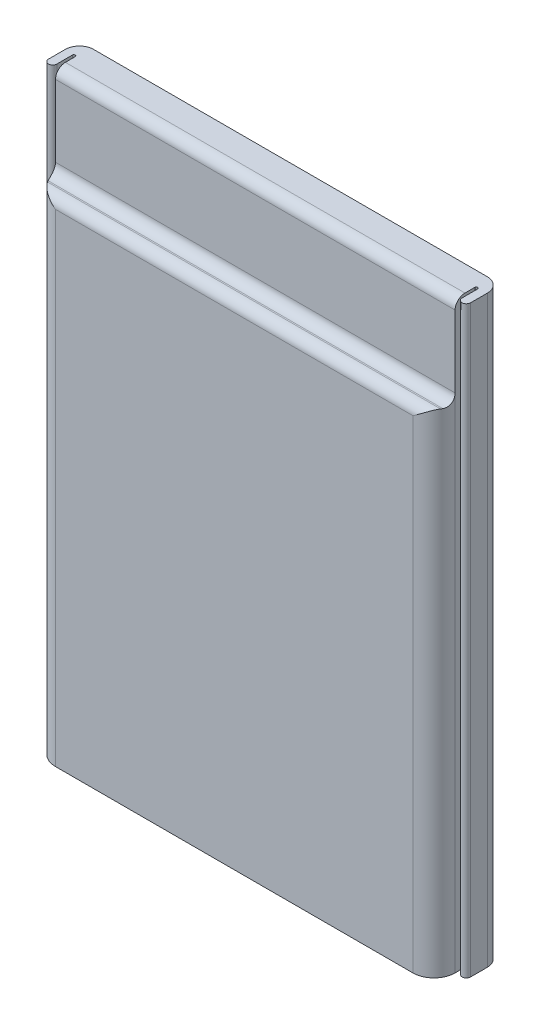
ISO-10303-21;
HEADER;
FILE_DESCRIPTION(('STEP AP214'),'2;1');
FILE_NAME('part.step','',(''),(''),'','','');
FILE_SCHEMA(('AUTOMOTIVE_DESIGN { 1 0 10303 214 1 1 1 1 }'));
ENDSEC;
DATA;
#1=APPLICATION_CONTEXT('core data for automotive mechanical design processes');
#2=APPLICATION_PROTOCOL_DEFINITION('international standard','automotive_design',2000,#1);
#3=PRODUCT_CONTEXT('',#1,'mechanical');
#4=PRODUCT('Part','Part','',(#3));
#5=PRODUCT_RELATED_PRODUCT_CATEGORY('part','',(#4));
#6=PRODUCT_DEFINITION_FORMATION('','',#4);
#7=PRODUCT_DEFINITION_CONTEXT('part definition',#1,'design');
#8=PRODUCT_DEFINITION('design','',#6,#7);
#9=PRODUCT_DEFINITION_SHAPE('','',#8);
#10=(LENGTH_UNIT() NAMED_UNIT(*) SI_UNIT(.MILLI.,.METRE.));
#11=(NAMED_UNIT(*) PLANE_ANGLE_UNIT() SI_UNIT($,.RADIAN.));
#12=(NAMED_UNIT(*) SI_UNIT($,.STERADIAN.) SOLID_ANGLE_UNIT());
#13=UNCERTAINTY_MEASURE_WITH_UNIT(LENGTH_MEASURE(1.E-05),#10,'distance_accuracy_value','');
#14=(GEOMETRIC_REPRESENTATION_CONTEXT(3) GLOBAL_UNCERTAINTY_ASSIGNED_CONTEXT((#13)) GLOBAL_UNIT_ASSIGNED_CONTEXT((#10,
#11,#12)) REPRESENTATION_CONTEXT('',''));
#15=CARTESIAN_POINT('',(0.,0.,0.));
#16=DIRECTION('',(0.,0.,1.));
#17=DIRECTION('',(1.,0.,0.));
#18=AXIS2_PLACEMENT_3D('',#15,#16,#17);
#19=CARTESIAN_POINT('',(-14.2,20.75,2.5));
#20=DIRECTION('',(1.,0.,0.));
#21=DIRECTION('',(0.,0.,-1.));
#22=AXIS2_PLACEMENT_3D('',#19,#20,#21);
#23=PLANE('',#22);
#24=CARTESIAN_POINT('',(-14.2,20.05,1.8));
#25=DIRECTION('',(1.,0.,0.));
#26=DIRECTION('',(0.,0.,-1.));
#27=AXIS2_PLACEMENT_3D('',#24,#25,#26);
#28=CIRCLE('',#27,0.700000000000001);
#29=CARTESIAN_POINT('',(-14.2,20.75,1.8));
#30=VERTEX_POINT('',#29);
#31=CARTESIAN_POINT('',(-14.2,20.05,2.5));
#32=VERTEX_POINT('',#31);
#33=EDGE_CURVE('E452',#30,#32,#28,.T.);
#34=ORIENTED_EDGE('',*,*,#33,.F.);
#35=DIRECTION('',(0.,0.,1.));
#36=VECTOR('',#35,1.);
#37=CARTESIAN_POINT('',(-14.2,20.75,2.5));
#38=LINE('',#37,#36);
#39=CARTESIAN_POINT('',(-14.2,20.75,1.1));
#40=VERTEX_POINT('',#39);
#41=EDGE_CURVE('E268',#40,#30,#38,.T.);
#42=ORIENTED_EDGE('',*,*,#41,.F.);
#43=DIRECTION('',(0.,-1.,0.));
#44=VECTOR('',#43,1.);
#45=CARTESIAN_POINT('',(-14.2,20.75,1.1));
#46=LINE('',#45,#44);
#47=CARTESIAN_POINT('',(-14.2,-20.75,1.1));
#48=VERTEX_POINT('',#47);
#49=EDGE_CURVE('E236',#40,#48,#46,.T.);
#50=ORIENTED_EDGE('',*,*,#49,.T.);
#51=DIRECTION('',(0.,0.,1.));
#52=VECTOR('',#51,1.);
#53=CARTESIAN_POINT('',(-14.2,-20.75,2.5));
#54=LINE('',#53,#52);
#55=CARTESIAN_POINT('',(-14.2,-20.75,2.5));
#56=VERTEX_POINT('',#55);
#57=EDGE_CURVE('E191',#48,#56,#54,.T.);
#58=ORIENTED_EDGE('',*,*,#57,.T.);
#59=DIRECTION('',(0.,-1.,0.));
#60=VECTOR('',#59,1.);
#61=CARTESIAN_POINT('',(-14.2,20.75,2.5));
#62=LINE('',#61,#60);
#63=CARTESIAN_POINT('',(-14.2,14.95,2.5));
#64=VERTEX_POINT('',#63);
#65=EDGE_CURVE('E234',#64,#56,#62,.T.);
#66=ORIENTED_EDGE('',*,*,#65,.F.);
#67=DIRECTION('',(0.,-1.,0.));
#68=VECTOR('',#67,1.);
#69=CARTESIAN_POINT('',(-14.2,20.75,2.5));
#70=LINE('',#69,#68);
#71=EDGE_CURVE('E435',#32,#64,#70,.T.);
#72=ORIENTED_EDGE('',*,*,#71,.F.);
#73=EDGE_LOOP('',(#34,#42,#50,#58,#66,#72));
#74=FACE_BOUND('',#73,.T.);
#75=ADVANCED_FACE('F35',(#74),#23,.F.);
#76=CARTESIAN_POINT('',(-12.7,20.75,2.5));
#77=DIRECTION('',(0.,-1.,0.));
#78=DIRECTION('',(0.,0.,-1.));
#79=AXIS2_PLACEMENT_3D('',#76,#77,#78);
#80=CYLINDRICAL_SURFACE('',#79,1.5);
#81=CARTESIAN_POINT('',(-14.2,14.95,2.5));
#82=CARTESIAN_POINT('',(-14.1999561462918,14.9107046356708,2.49996665730778));
#83=CARTESIAN_POINT('',(-14.1999992482191,14.8714183542362,2.50330687650236));
#84=CARTESIAN_POINT('',(-14.1999354164387,14.793967429043,2.51649162392108));
#85=CARTESIAN_POINT('',(-14.1998285413028,14.7558023533524,2.52633361216168));
#86=CARTESIAN_POINT('',(-14.1991410740691,14.6816427129099,2.55228720768836));
#87=CARTESIAN_POINT('',(-14.198560198109,14.645649462663,2.56840256885166));
#88=CARTESIAN_POINT('',(-14.1963416248353,14.5768985139939,2.60642040046059));
#89=CARTESIAN_POINT('',(-14.1947040963163,14.5441402997553,2.62832194626366));
#90=CARTESIAN_POINT('',(-14.1897174760021,14.4831035334169,2.677010616108));
#91=CARTESIAN_POINT('',(-14.1863838519975,14.4547874718156,2.70375220489331));
#92=CARTESIAN_POINT('',(-14.1773485077593,14.4031440562724,2.76131822449821));
#93=CARTESIAN_POINT('',(-14.1716483772418,14.379813369279,2.79213990504022));
#94=CARTESIAN_POINT('',(-14.1576029305689,14.3395024190182,2.85553925871004));
#95=CARTESIAN_POINT('',(-14.1493602479741,14.3223237472487,2.88801374582642));
#96=CARTESIAN_POINT('',(-14.1299019482591,14.2934557940061,2.95451175346917));
#97=CARTESIAN_POINT('',(-14.1186838942042,14.281771034092,2.98853652472772));
#98=CARTESIAN_POINT('',(-14.0949002980657,14.2650221516101,3.05250454046783));
#99=CARTESIAN_POINT('',(-14.0826903337623,14.2593026309378,3.08241352289095));
#100=CARTESIAN_POINT('',(-14.0561914981021,14.2517861713414,3.14172953845446));
#101=CARTESIAN_POINT('',(-14.0419070504447,14.249981012626,3.17113749452254));
#102=CARTESIAN_POINT('',(-14.0266499161422,14.25,3.2));
#103=B_SPLINE_CURVE_WITH_KNOTS('',3,(#81,#82,#83,#84,#85,#86,#87,#88,#89,#90,#91,#92,#93,#94,
#95,#96,#97,#98,#99,#100,#101,#102),.UNSPECIFIED.,.F.,.F.,(4,2,2,2,2,2,2,2,2,2,4),(0.,
0.117731700981388,0.235417436029151,0.353173700690375,0.470911159062051,0.587593641092844,
0.704197867411869,0.816603597131317,0.929101676953002,1.0272186022184,1.12512929085055),.UNSPECIFIED.);
#104=CARTESIAN_POINT('',(-14.0266499161422,14.25,3.2));
#105=VERTEX_POINT('',#104);
#106=EDGE_CURVE('E432',#64,#105,#103,.T.);
#107=ORIENTED_EDGE('',*,*,#106,.F.);
#108=ORIENTED_EDGE('',*,*,#65,.T.);
#109=CARTESIAN_POINT('',(-12.7,-20.75,2.5));
#110=DIRECTION('',(0.,1.,0.));
#111=DIRECTION('',(0.,0.,1.));
#112=AXIS2_PLACEMENT_3D('',#109,#110,#111);
#113=CIRCLE('',#112,1.5);
#114=CARTESIAN_POINT('',(-12.7,-20.75,4.));
#115=VERTEX_POINT('',#114);
#116=EDGE_CURVE('E194',#56,#115,#113,.T.);
#117=ORIENTED_EDGE('',*,*,#116,.T.);
#118=DIRECTION('',(0.,-1.,0.));
#119=VECTOR('',#118,1.);
#120=CARTESIAN_POINT('',(-12.7,20.75,4.));
#121=LINE('',#120,#119);
#122=CARTESIAN_POINT('',(-12.7,13.55,4.));
#123=VERTEX_POINT('',#122);
#124=EDGE_CURVE('E232',#123,#115,#121,.T.);
#125=ORIENTED_EDGE('',*,*,#124,.F.);
#126=CARTESIAN_POINT('',(-13.968857754045,14.25,3.3));
#127=CARTESIAN_POINT('',(-13.9527784417981,14.2499982055545,3.32551396463836));
#128=CARTESIAN_POINT('',(-13.9359410582917,14.2486060689017,3.35050252186088));
#129=CARTESIAN_POINT('',(-13.9009676886166,14.2433665296013,3.39920481996247));
#130=CARTESIAN_POINT('',(-13.8828347064415,14.2395246527944,3.42292130005025));
#131=CARTESIAN_POINT('',(-13.8271702625634,14.224922406964,3.49142221954592));
#132=CARTESIAN_POINT('',(-13.7879636566091,14.2110687175682,3.53420132491162));
#133=CARTESIAN_POINT('',(-13.6958598687309,14.172878872689,3.62401554035444));
#134=CARTESIAN_POINT('',(-13.6420377008067,14.1467617112175,3.66930815190718));
#135=CARTESIAN_POINT('',(-13.5308303258263,14.087882443994,3.75080325405991));
#136=CARTESIAN_POINT('',(-13.4734254431628,14.0550808982158,3.78694879598609));
#137=CARTESIAN_POINT('',(-13.3325796058719,13.9708369597608,3.86331326015554));
#138=CARTESIAN_POINT('',(-13.2480697193284,13.9172485733349,3.89917970849285));
#139=CARTESIAN_POINT('',(-13.0770548572683,13.8056468566582,3.95461504825333));
#140=CARTESIAN_POINT('',(-12.9905529750848,13.7476401017941,3.97420766027137));
#141=CARTESIAN_POINT('',(-12.8380345556903,13.6442840524469,3.99509898601819));
#142=CARTESIAN_POINT('',(-12.7721970696735,13.599319628047,3.99970591144029));
#143=CARTESIAN_POINT('',(-12.7042639764878,13.5529128504283,3.99999545061156));
#144=CARTESIAN_POINT('',(-12.7021319644632,13.5514564089068,3.99999999550149));
#145=CARTESIAN_POINT('',(-12.7,13.55,4.));
#146=B_SPLINE_CURVE_WITH_KNOTS('',3,(#126,#127,#128,#129,#130,#131,#132,#133,#134,#135,#136,
#137,#138,#139,#140,#141,#142,#143,#144,#145),.UNSPECIFIED.,.F.,.F.,(4,2,2,2,2,2,2,2,2,4),(0.,
0.0903647747938651,0.180526432789846,0.358599701535536,0.582545843187146,0.807853726825026,
1.12506490330325,1.44181290024313,1.68087549653736,1.688621475233),.UNSPECIFIED.);
#147=CARTESIAN_POINT('',(-13.968857754045,14.25,3.3));
#148=VERTEX_POINT('',#147);
#149=EDGE_CURVE('E433',#148,#123,#146,.T.);
#150=ORIENTED_EDGE('',*,*,#149,.F.);
#151=CARTESIAN_POINT('',(-12.7,14.25,2.5));
#152=DIRECTION('',(0.,-1.,0.));
#153=DIRECTION('',(0.,0.,-1.));
#154=AXIS2_PLACEMENT_3D('',#151,#152,#153);
#155=CIRCLE('',#154,1.5);
#156=EDGE_CURVE('E426',#105,#148,#155,.F.);
#157=ORIENTED_EDGE('',*,*,#156,.F.);
#158=EDGE_LOOP('',(#107,#108,#117,#125,#150,#157));
#159=FACE_BOUND('',#158,.T.);
#160=ADVANCED_FACE('F360',(#159),#80,.T.);
#161=CARTESIAN_POINT('',(12.7,20.75,2.5));
#162=DIRECTION('',(0.,-1.,0.));
#163=DIRECTION('',(0.,0.,-1.));
#164=AXIS2_PLACEMENT_3D('',#161,#162,#163);
#165=CYLINDRICAL_SURFACE('',#164,1.5);
#166=CARTESIAN_POINT('',(14.2,14.95,2.5));
#167=CARTESIAN_POINT('',(14.1999561462918,14.9107046356708,2.49996665730778));
#168=CARTESIAN_POINT('',(14.1999992482191,14.8714183542362,2.50330687650236));
#169=CARTESIAN_POINT('',(14.1999354164387,14.793967429043,2.51649162392108));
#170=CARTESIAN_POINT('',(14.1998285413028,14.7558023533524,2.52633361216168));
#171=CARTESIAN_POINT('',(14.1991410740691,14.6816427129099,2.55228720768836));
#172=CARTESIAN_POINT('',(14.198560198109,14.645649462663,2.56840256885166));
#173=CARTESIAN_POINT('',(14.1963416248353,14.5768985139939,2.60642040046059));
#174=CARTESIAN_POINT('',(14.1947040963163,14.5441402997553,2.62832194626366));
#175=CARTESIAN_POINT('',(14.1897174760021,14.4831035334169,2.677010616108));
#176=CARTESIAN_POINT('',(14.1863838519975,14.4547874718156,2.70375220489331));
#177=CARTESIAN_POINT('',(14.1773485077593,14.4031440562724,2.76131822449821));
#178=CARTESIAN_POINT('',(14.1716483772418,14.379813369279,2.79213990504022));
#179=CARTESIAN_POINT('',(14.1576029305689,14.3395024190182,2.85553925871004));
#180=CARTESIAN_POINT('',(14.1493602479741,14.3223237472487,2.88801374582642));
#181=CARTESIAN_POINT('',(14.1299019482591,14.2934557940061,2.95451175346917));
#182=CARTESIAN_POINT('',(14.1186838942042,14.281771034092,2.98853652472772));
#183=CARTESIAN_POINT('',(14.0949002980657,14.2650221516101,3.05250454046783));
#184=CARTESIAN_POINT('',(14.0826903337623,14.2593026309378,3.08241352289095));
#185=CARTESIAN_POINT('',(14.0561914981021,14.2517861713414,3.14172953845446));
#186=CARTESIAN_POINT('',(14.0419070504447,14.249981012626,3.17113749452254));
#187=CARTESIAN_POINT('',(14.0266499161422,14.25,3.2));
#188=B_SPLINE_CURVE_WITH_KNOTS('',3,(#166,#167,#168,#169,#170,#171,#172,#173,#174,#175,#176,
#177,#178,#179,#180,#181,#182,#183,#184,#185,#186,#187),.UNSPECIFIED.,.F.,.F.,(4,2,2,2,2,2,2,2,
2,2,4),(0.,0.117731700981388,0.235417436029151,0.353173700690375,0.470911159062051,
0.587593641092844,0.704197867411869,0.816603597131317,0.929101676953003,1.0272186022184,
1.12512929085055),.UNSPECIFIED.);
#189=CARTESIAN_POINT('',(14.2,14.95,2.5));
#190=VERTEX_POINT('',#189);
#191=CARTESIAN_POINT('',(14.0266499161422,14.25,3.2));
#192=VERTEX_POINT('',#191);
#193=EDGE_CURVE('E339',#190,#192,#188,.T.);
#194=ORIENTED_EDGE('',*,*,#193,.T.);
#195=CARTESIAN_POINT('',(12.7,14.25,2.5));
#196=DIRECTION('',(0.,1.,0.));
#197=DIRECTION('',(0.,0.,1.));
#198=AXIS2_PLACEMENT_3D('',#195,#196,#197);
#199=CIRCLE('',#198,1.5);
#200=CARTESIAN_POINT('',(13.968857754045,14.25,3.3));
#201=VERTEX_POINT('',#200);
#202=EDGE_CURVE('E325',#192,#201,#199,.F.);
#203=ORIENTED_EDGE('',*,*,#202,.T.);
#204=CARTESIAN_POINT('',(13.968857754045,14.25,3.3));
#205=CARTESIAN_POINT('',(13.9527784417981,14.2499982055545,3.32551396463836));
#206=CARTESIAN_POINT('',(13.9359410582917,14.2486060689017,3.35050252186088));
#207=CARTESIAN_POINT('',(13.9009676886166,14.2433665296013,3.39920481996247));
#208=CARTESIAN_POINT('',(13.8828347064415,14.2395246527944,3.42292130005025));
#209=CARTESIAN_POINT('',(13.8271702625634,14.224922406964,3.49142221954592));
#210=CARTESIAN_POINT('',(13.7879636566091,14.2110687175682,3.53420132491162));
#211=CARTESIAN_POINT('',(13.6958598687309,14.172878872689,3.62401554035444));
#212=CARTESIAN_POINT('',(13.6420377008067,14.1467617112175,3.66930815190718));
#213=CARTESIAN_POINT('',(13.5308303258263,14.087882443994,3.75080325405991));
#214=CARTESIAN_POINT('',(13.4734254431628,14.0550808982158,3.78694879598609));
#215=CARTESIAN_POINT('',(13.3325796058719,13.9708369597608,3.86331326015554));
#216=CARTESIAN_POINT('',(13.2480697193284,13.9172485733349,3.89917970849285));
#217=CARTESIAN_POINT('',(13.0770548572683,13.8056468566582,3.95461504825333));
#218=CARTESIAN_POINT('',(12.9905529750848,13.747640101794,3.97420766027137));
#219=CARTESIAN_POINT('',(12.8380345556903,13.6442840524469,3.99509898601819));
#220=CARTESIAN_POINT('',(12.7721970696734,13.5993196280471,3.99970591144029));
#221=CARTESIAN_POINT('',(12.7042639764878,13.5529128504283,3.99999545061156));
#222=CARTESIAN_POINT('',(12.7021319644632,13.5514564089068,3.99999999550149));
#223=CARTESIAN_POINT('',(12.7,13.55,4.));
#224=B_SPLINE_CURVE_WITH_KNOTS('',3,(#204,#205,#206,#207,#208,#209,#210,#211,#212,#213,#214,
#215,#216,#217,#218,#219,#220,#221,#222,#223),.UNSPECIFIED.,.F.,.F.,(4,2,2,2,2,2,2,2,2,4),(0.,
0.0903647747938654,0.180526432789845,0.358599701535538,0.582545843187147,0.807853726825025,
1.12506490330324,1.44181290024313,1.68087549653736,1.688621475233),.UNSPECIFIED.);
#225=CARTESIAN_POINT('',(12.7,13.55,4.));
#226=VERTEX_POINT('',#225);
#227=EDGE_CURVE('E316',#201,#226,#224,.T.);
#228=ORIENTED_EDGE('',*,*,#227,.T.);
#229=DIRECTION('',(0.,-1.,0.));
#230=VECTOR('',#229,1.);
#231=CARTESIAN_POINT('',(12.7,20.75,4.));
#232=LINE('',#231,#230);
#233=CARTESIAN_POINT('',(12.7,-20.75,4.));
#234=VERTEX_POINT('',#233);
#235=EDGE_CURVE('E230',#226,#234,#232,.T.);
#236=ORIENTED_EDGE('',*,*,#235,.T.);
#237=CARTESIAN_POINT('',(12.7,-20.75,2.5));
#238=DIRECTION('',(0.,1.,0.));
#239=DIRECTION('',(0.,0.,-1.));
#240=AXIS2_PLACEMENT_3D('',#237,#238,#239);
#241=CIRCLE('',#240,1.5);
#242=CARTESIAN_POINT('',(14.2,-20.75,2.5));
#243=VERTEX_POINT('',#242);
#244=EDGE_CURVE('E200',#234,#243,#241,.T.);
#245=ORIENTED_EDGE('',*,*,#244,.T.);
#246=DIRECTION('',(0.,-1.,0.));
#247=VECTOR('',#246,1.);
#248=CARTESIAN_POINT('',(14.2,20.75,2.5));
#249=LINE('',#248,#247);
#250=EDGE_CURVE('E228',#190,#243,#249,.T.);
#251=ORIENTED_EDGE('',*,*,#250,.F.);
#252=EDGE_LOOP('',(#194,#203,#228,#236,#245,#251));
#253=FACE_BOUND('',#252,.T.);
#254=ADVANCED_FACE('F366',(#253),#165,.T.);
#255=CARTESIAN_POINT('',(14.2,20.75,1.10000000000001));
#256=DIRECTION('',(-1.,0.,0.));
#257=DIRECTION('',(0.,0.,1.));
#258=AXIS2_PLACEMENT_3D('',#255,#256,#257);
#259=PLANE('',#258);
#260=CARTESIAN_POINT('',(14.2,20.05,1.8));
#261=DIRECTION('',(-1.,0.,0.));
#262=DIRECTION('',(0.,0.,1.));
#263=AXIS2_PLACEMENT_3D('',#260,#261,#262);
#264=CIRCLE('',#263,0.700000000000001);
#265=CARTESIAN_POINT('',(14.2,20.75,1.8));
#266=VERTEX_POINT('',#265);
#267=CARTESIAN_POINT('',(14.2,20.05,2.5));
#268=VERTEX_POINT('',#267);
#269=EDGE_CURVE('E50',#266,#268,#264,.F.);
#270=ORIENTED_EDGE('',*,*,#269,.T.);
#271=DIRECTION('',(0.,-1.,0.));
#272=VECTOR('',#271,1.);
#273=CARTESIAN_POINT('',(14.2,20.05,2.5));
#274=LINE('',#273,#272);
#275=EDGE_CURVE('E183',#268,#190,#274,.T.);
#276=ORIENTED_EDGE('',*,*,#275,.T.);
#277=ORIENTED_EDGE('',*,*,#250,.T.);
#278=DIRECTION('',(0.,0.,-1.));
#279=VECTOR('',#278,1.);
#280=CARTESIAN_POINT('',(14.2,-20.75,1.10000000000001));
#281=LINE('',#280,#279);
#282=CARTESIAN_POINT('',(14.2,-20.75,1.10000000000001));
#283=VERTEX_POINT('',#282);
#284=EDGE_CURVE('E203',#243,#283,#281,.T.);
#285=ORIENTED_EDGE('',*,*,#284,.T.);
#286=DIRECTION('',(0.,-1.,0.));
#287=VECTOR('',#286,1.);
#288=CARTESIAN_POINT('',(14.2,20.75,1.10000000000001));
#289=LINE('',#288,#287);
#290=CARTESIAN_POINT('',(14.2,20.75,1.10000000000001));
#291=VERTEX_POINT('',#290);
#292=EDGE_CURVE('E225',#291,#283,#289,.T.);
#293=ORIENTED_EDGE('',*,*,#292,.F.);
#294=DIRECTION('',(0.,0.,-1.));
#295=VECTOR('',#294,1.);
#296=CARTESIAN_POINT('',(14.2,20.75,1.10000000000001));
#297=LINE('',#296,#295);
#298=EDGE_CURVE('E271',#266,#291,#297,.T.);
#299=ORIENTED_EDGE('',*,*,#298,.F.);
#300=EDGE_LOOP('',(#270,#276,#277,#285,#293,#299));
#301=FACE_BOUND('',#300,.T.);
#302=ADVANCED_FACE('F383',(#301),#259,.F.);
#303=CARTESIAN_POINT('',(-14.,20.75,1.));
#304=DIRECTION('',(0.,-1.,0.));
#305=DIRECTION('',(0.,0.,-1.));
#306=AXIS2_PLACEMENT_3D('',#303,#304,#305);
#307=CYLINDRICAL_SURFACE('',#306,1.);
#308=CARTESIAN_POINT('',(-14.,-20.75,1.));
#309=DIRECTION('',(0.,1.,0.));
#310=DIRECTION('',(0.,0.,1.));
#311=AXIS2_PLACEMENT_3D('',#308,#309,#310);
#312=CIRCLE('',#311,1.);
#313=CARTESIAN_POINT('',(-14.,-20.75,0.));
#314=VERTEX_POINT('',#313);
#315=CARTESIAN_POINT('',(-15.,-20.75,1.));
#316=VERTEX_POINT('',#315);
#317=EDGE_CURVE('E179',#314,#316,#312,.T.);
#318=ORIENTED_EDGE('',*,*,#317,.T.);
#319=DIRECTION('',(0.,-1.,0.));
#320=VECTOR('',#319,1.);
#321=CARTESIAN_POINT('',(-15.,20.75,1.));
#322=LINE('',#321,#320);
#323=CARTESIAN_POINT('',(-15.,20.75,1.));
#324=VERTEX_POINT('',#323);
#325=EDGE_CURVE('E11',#324,#316,#322,.T.);
#326=ORIENTED_EDGE('',*,*,#325,.F.);
#327=CARTESIAN_POINT('',(-14.,20.75,1.));
#328=DIRECTION('',(0.,1.,0.));
#329=DIRECTION('',(0.,0.,1.));
#330=AXIS2_PLACEMENT_3D('',#327,#328,#329);
#331=CIRCLE('',#330,1.);
#332=CARTESIAN_POINT('',(-14.,20.75,0.));
#333=VERTEX_POINT('',#332);
#334=EDGE_CURVE('E215',#333,#324,#331,.T.);
#335=ORIENTED_EDGE('',*,*,#334,.F.);
#336=DIRECTION('',(0.,-1.,0.));
#337=VECTOR('',#336,1.);
#338=CARTESIAN_POINT('',(-14.,20.75,0.));
#339=LINE('',#338,#337);
#340=EDGE_CURVE('E175',#333,#314,#339,.T.);
#341=ORIENTED_EDGE('',*,*,#340,.T.);
#342=EDGE_LOOP('',(#318,#326,#335,#341));
#343=FACE_BOUND('',#342,.T.);
#344=ADVANCED_FACE('F37',(#343),#307,.T.);
#345=CARTESIAN_POINT('',(-15.,20.75,1.));
#346=DIRECTION('',(1.,0.,0.));
#347=DIRECTION('',(0.,0.,-1.));
#348=AXIS2_PLACEMENT_3D('',#345,#346,#347);
#349=PLANE('',#348);
#350=DIRECTION('',(0.,0.,1.));
#351=VECTOR('',#350,1.);
#352=CARTESIAN_POINT('',(-15.,-20.75,1.));
#353=LINE('',#352,#351);
#354=CARTESIAN_POINT('',(-15.,-20.75,2.2));
#355=VERTEX_POINT('',#354);
#356=EDGE_CURVE('E182',#316,#355,#353,.T.);
#357=ORIENTED_EDGE('',*,*,#356,.T.);
#358=DIRECTION('',(0.,-1.,0.));
#359=VECTOR('',#358,1.);
#360=CARTESIAN_POINT('',(-15.,20.75,2.2));
#361=LINE('',#360,#359);
#362=CARTESIAN_POINT('',(-15.,20.75,2.2));
#363=VERTEX_POINT('',#362);
#364=EDGE_CURVE('E43',#363,#355,#361,.T.);
#365=ORIENTED_EDGE('',*,*,#364,.F.);
#366=DIRECTION('',(0.,0.,1.));
#367=VECTOR('',#366,1.);
#368=CARTESIAN_POINT('',(-15.,20.75,1.));
#369=LINE('',#368,#367);
#370=EDGE_CURVE('E124',#324,#363,#369,.T.);
#371=ORIENTED_EDGE('',*,*,#370,.F.);
#372=ORIENTED_EDGE('',*,*,#325,.T.);
#373=EDGE_LOOP('',(#357,#365,#371,#372));
#374=FACE_BOUND('',#373,.T.);
#375=ADVANCED_FACE('F378',(#374),#349,.F.);
#376=CARTESIAN_POINT('',(-14.7,20.75,2.2));
#377=DIRECTION('',(0.,-1.,0.));
#378=DIRECTION('',(0.,0.,-1.));
#379=AXIS2_PLACEMENT_3D('',#376,#377,#378);
#380=CYLINDRICAL_SURFACE('',#379,0.299999999999998);
#381=CARTESIAN_POINT('',(-14.7,-20.75,2.2));
#382=DIRECTION('',(0.,1.,0.));
#383=DIRECTION('',(0.,0.,1.));
#384=AXIS2_PLACEMENT_3D('',#381,#382,#383);
#385=CIRCLE('',#384,0.299999999999998);
#386=CARTESIAN_POINT('',(-14.4,-20.75,2.2));
#387=VERTEX_POINT('',#386);
#388=EDGE_CURVE('E185',#355,#387,#385,.T.);
#389=ORIENTED_EDGE('',*,*,#388,.T.);
#390=DIRECTION('',(0.,-1.,0.));
#391=VECTOR('',#390,1.);
#392=CARTESIAN_POINT('',(-14.4,20.75,2.2));
#393=LINE('',#392,#391);
#394=CARTESIAN_POINT('',(-14.4,20.75,2.2));
#395=VERTEX_POINT('',#394);
#396=EDGE_CURVE('E242',#395,#387,#393,.T.);
#397=ORIENTED_EDGE('',*,*,#396,.F.);
#398=CARTESIAN_POINT('',(-14.7,20.75,2.2));
#399=DIRECTION('',(0.,1.,0.));
#400=DIRECTION('',(0.,0.,1.));
#401=AXIS2_PLACEMENT_3D('',#398,#399,#400);
#402=CIRCLE('',#401,0.299999999999998);
#403=EDGE_CURVE('E250',#363,#395,#402,.T.);
#404=ORIENTED_EDGE('',*,*,#403,.F.);
#405=ORIENTED_EDGE('',*,*,#364,.T.);
#406=EDGE_LOOP('',(#389,#397,#404,#405));
#407=FACE_BOUND('',#406,.T.);
#408=ADVANCED_FACE('F248',(#407),#380,.T.);
#409=CARTESIAN_POINT('',(-14.4,20.75,2.2));
#410=DIRECTION('',(-1.,0.,0.));
#411=DIRECTION('',(0.,0.,1.));
#412=AXIS2_PLACEMENT_3D('',#409,#410,#411);
#413=PLANE('',#412);
#414=DIRECTION('',(0.,0.,-1.));
#415=VECTOR('',#414,1.);
#416=CARTESIAN_POINT('',(-14.4,-20.75,2.2));
#417=LINE('',#416,#415);
#418=CARTESIAN_POINT('',(-14.4,-20.75,1.1));
#419=VERTEX_POINT('',#418);
#420=EDGE_CURVE('E187',#387,#419,#417,.T.);
#421=ORIENTED_EDGE('',*,*,#420,.T.);
#422=DIRECTION('',(0.,-1.,0.));
#423=VECTOR('',#422,1.);
#424=CARTESIAN_POINT('',(-14.4,20.75,1.1));
#425=LINE('',#424,#423);
#426=CARTESIAN_POINT('',(-14.4,20.75,1.1));
#427=VERTEX_POINT('',#426);
#428=EDGE_CURVE('E239',#427,#419,#425,.T.);
#429=ORIENTED_EDGE('',*,*,#428,.F.);
#430=DIRECTION('',(0.,0.,-1.));
#431=VECTOR('',#430,1.);
#432=CARTESIAN_POINT('',(-14.4,20.75,2.2));
#433=LINE('',#432,#431);
#434=EDGE_CURVE('E269',#395,#427,#433,.T.);
#435=ORIENTED_EDGE('',*,*,#434,.F.);
#436=ORIENTED_EDGE('',*,*,#396,.T.);
#437=EDGE_LOOP('',(#421,#429,#435,#436));
#438=FACE_BOUND('',#437,.T.);
#439=ADVANCED_FACE('F259',(#438),#413,.F.);
#440=CARTESIAN_POINT('',(-14.3,20.75,1.1));
#441=DIRECTION('',(0.,-1.,0.));
#442=DIRECTION('',(0.,0.,-1.));
#443=AXIS2_PLACEMENT_3D('',#440,#441,#442);
#444=CYLINDRICAL_SURFACE('',#443,0.0999999999999994);
#445=CARTESIAN_POINT('',(-14.3,-20.75,1.1));
#446=DIRECTION('',(0.,-1.,0.));
#447=DIRECTION('',(0.,0.,1.));
#448=AXIS2_PLACEMENT_3D('',#445,#446,#447);
#449=CIRCLE('',#448,0.0999999999999994);
#450=EDGE_CURVE('E189',#419,#48,#449,.T.);
#451=ORIENTED_EDGE('',*,*,#450,.T.);
#452=ORIENTED_EDGE('',*,*,#49,.F.);
#453=CARTESIAN_POINT('',(-14.3,20.75,1.1));
#454=DIRECTION('',(0.,-1.,0.));
#455=DIRECTION('',(0.,0.,1.));
#456=AXIS2_PLACEMENT_3D('',#453,#454,#455);
#457=CIRCLE('',#456,0.0999999999999994);
#458=EDGE_CURVE('E265',#427,#40,#457,.T.);
#459=ORIENTED_EDGE('',*,*,#458,.F.);
#460=ORIENTED_EDGE('',*,*,#428,.T.);
#461=EDGE_LOOP('',(#451,#452,#459,#460));
#462=FACE_BOUND('',#461,.T.);
#463=ADVANCED_FACE('F263',(#462),#444,.F.);
#464=CARTESIAN_POINT('',(-12.7,20.75,4.));
#465=DIRECTION('',(0.,0.,-1.));
#466=DIRECTION('',(-1.,0.,0.));
#467=AXIS2_PLACEMENT_3D('',#464,#465,#466);
#468=PLANE('',#467);
#469=ORIENTED_EDGE('',*,*,#235,.F.);
#470=DIRECTION('',(-1.,0.,0.));
#471=VECTOR('',#470,1.);
#472=CARTESIAN_POINT('',(15.001,13.55,4.));
#473=LINE('',#472,#471);
#474=EDGE_CURVE('E301',#226,#123,#473,.T.);
#475=ORIENTED_EDGE('',*,*,#474,.T.);
#476=ORIENTED_EDGE('',*,*,#124,.T.);
#477=DIRECTION('',(1.,0.,0.));
#478=VECTOR('',#477,1.);
#479=CARTESIAN_POINT('',(-12.7,-20.75,4.));
#480=LINE('',#479,#478);
#481=EDGE_CURVE('E197',#115,#234,#480,.T.);
#482=ORIENTED_EDGE('',*,*,#481,.T.);
#483=EDGE_LOOP('',(#469,#475,#476,#482));
#484=FACE_BOUND('',#483,.T.);
#485=ADVANCED_FACE('F374',(#484),#468,.F.);
#486=CARTESIAN_POINT('',(14.3,20.75,1.10000000000001));
#487=DIRECTION('',(0.,-1.,0.));
#488=DIRECTION('',(0.,0.,-1.));
#489=AXIS2_PLACEMENT_3D('',#486,#487,#488);
#490=CYLINDRICAL_SURFACE('',#489,0.0999999999999994);
#491=CARTESIAN_POINT('',(14.3,-20.75,1.10000000000001));
#492=DIRECTION('',(0.,-1.,0.));
#493=DIRECTION('',(0.,0.,-1.));
#494=AXIS2_PLACEMENT_3D('',#491,#492,#493);
#495=CIRCLE('',#494,0.0999999999999994);
#496=CARTESIAN_POINT('',(14.4,-20.75,1.10000000000001));
#497=VERTEX_POINT('',#496);
#498=EDGE_CURVE('E205',#283,#497,#495,.T.);
#499=ORIENTED_EDGE('',*,*,#498,.T.);
#500=DIRECTION('',(0.,-1.,0.));
#501=VECTOR('',#500,1.);
#502=CARTESIAN_POINT('',(14.4,20.75,1.10000000000001));
#503=LINE('',#502,#501);
#504=CARTESIAN_POINT('',(14.4,20.75,1.10000000000001));
#505=VERTEX_POINT('',#504);
#506=EDGE_CURVE('E222',#505,#497,#503,.T.);
#507=ORIENTED_EDGE('',*,*,#506,.F.);
#508=CARTESIAN_POINT('',(14.3,20.75,1.10000000000001));
#509=DIRECTION('',(0.,-1.,0.));
#510=DIRECTION('',(0.,0.,-1.));
#511=AXIS2_PLACEMENT_3D('',#508,#509,#510);
#512=CIRCLE('',#511,0.0999999999999994);
#513=EDGE_CURVE('E277',#291,#505,#512,.T.);
#514=ORIENTED_EDGE('',*,*,#513,.F.);
#515=ORIENTED_EDGE('',*,*,#292,.T.);
#516=EDGE_LOOP('',(#499,#507,#514,#515));
#517=FACE_BOUND('',#516,.T.);
#518=ADVANCED_FACE('F395',(#517),#490,.F.);
#519=CARTESIAN_POINT('',(14.4,20.75,2.20000000000001));
#520=DIRECTION('',(1.,0.,0.));
#521=DIRECTION('',(0.,0.,-1.));
#522=AXIS2_PLACEMENT_3D('',#519,#520,#521);
#523=PLANE('',#522);
#524=DIRECTION('',(0.,0.,1.));
#525=VECTOR('',#524,1.);
#526=CARTESIAN_POINT('',(14.4,-20.75,2.20000000000001));
#527=LINE('',#526,#525);
#528=CARTESIAN_POINT('',(14.4,-20.75,2.20000000000001));
#529=VERTEX_POINT('',#528);
#530=EDGE_CURVE('E207',#497,#529,#527,.T.);
#531=ORIENTED_EDGE('',*,*,#530,.T.);
#532=DIRECTION('',(0.,-1.,0.));
#533=VECTOR('',#532,1.);
#534=CARTESIAN_POINT('',(14.4,20.75,2.20000000000001));
#535=LINE('',#534,#533);
#536=CARTESIAN_POINT('',(14.4,20.75,2.20000000000001));
#537=VERTEX_POINT('',#536);
#538=EDGE_CURVE('E219',#537,#529,#535,.T.);
#539=ORIENTED_EDGE('',*,*,#538,.F.);
#540=DIRECTION('',(0.,0.,1.));
#541=VECTOR('',#540,1.);
#542=CARTESIAN_POINT('',(14.4,20.75,2.20000000000001));
#543=LINE('',#542,#541);
#544=EDGE_CURVE('E279',#505,#537,#543,.T.);
#545=ORIENTED_EDGE('',*,*,#544,.F.);
#546=ORIENTED_EDGE('',*,*,#506,.T.);
#547=EDGE_LOOP('',(#531,#539,#545,#546));
#548=FACE_BOUND('',#547,.T.);
#549=ADVANCED_FACE('F285',(#548),#523,.F.);
#550=CARTESIAN_POINT('',(14.7,20.75,2.20000000000001));
#551=DIRECTION('',(0.,-1.,0.));
#552=DIRECTION('',(0.,0.,-1.));
#553=AXIS2_PLACEMENT_3D('',#550,#551,#552);
#554=CYLINDRICAL_SURFACE('',#553,0.299999999999995);
#555=CARTESIAN_POINT('',(14.7,-20.75,2.20000000000001));
#556=DIRECTION('',(0.,1.,0.));
#557=DIRECTION('',(0.,0.,-1.));
#558=AXIS2_PLACEMENT_3D('',#555,#556,#557);
#559=CIRCLE('',#558,0.299999999999995);
#560=CARTESIAN_POINT('',(15.,-20.75,2.20000000000001));
#561=VERTEX_POINT('',#560);
#562=EDGE_CURVE('E209',#529,#561,#559,.T.);
#563=ORIENTED_EDGE('',*,*,#562,.T.);
#564=DIRECTION('',(0.,-1.,0.));
#565=VECTOR('',#564,1.);
#566=CARTESIAN_POINT('',(15.,20.75,2.20000000000001));
#567=LINE('',#566,#565);
#568=CARTESIAN_POINT('',(15.,20.75,2.20000000000001));
#569=VERTEX_POINT('',#568);
#570=EDGE_CURVE('E170',#569,#561,#567,.T.);
#571=ORIENTED_EDGE('',*,*,#570,.F.);
#572=CARTESIAN_POINT('',(14.7,20.75,2.20000000000001));
#573=DIRECTION('',(0.,1.,0.));
#574=DIRECTION('',(0.,0.,-1.));
#575=AXIS2_PLACEMENT_3D('',#572,#573,#574);
#576=CIRCLE('',#575,0.299999999999995);
#577=EDGE_CURVE('E158',#537,#569,#576,.T.);
#578=ORIENTED_EDGE('',*,*,#577,.F.);
#579=ORIENTED_EDGE('',*,*,#538,.T.);
#580=EDGE_LOOP('',(#563,#571,#578,#579));
#581=FACE_BOUND('',#580,.T.);
#582=ADVANCED_FACE('F289',(#581),#554,.T.);
#583=CARTESIAN_POINT('',(15.,20.75,1.));
#584=DIRECTION('',(-1.,0.,0.));
#585=DIRECTION('',(0.,0.,1.));
#586=AXIS2_PLACEMENT_3D('',#583,#584,#585);
#587=PLANE('',#586);
#588=DIRECTION('',(0.,0.,-1.));
#589=VECTOR('',#588,1.);
#590=CARTESIAN_POINT('',(15.,-20.75,1.));
#591=LINE('',#590,#589);
#592=CARTESIAN_POINT('',(15.,-20.75,1.));
#593=VERTEX_POINT('',#592);
#594=EDGE_CURVE('E167',#561,#593,#591,.T.);
#595=ORIENTED_EDGE('',*,*,#594,.T.);
#596=DIRECTION('',(0.,-1.,0.));
#597=VECTOR('',#596,1.);
#598=CARTESIAN_POINT('',(15.,20.75,1.));
#599=LINE('',#598,#597);
#600=CARTESIAN_POINT('',(15.,20.75,1.));
#601=VERTEX_POINT('',#600);
#602=EDGE_CURVE('E164',#601,#593,#599,.T.);
#603=ORIENTED_EDGE('',*,*,#602,.F.);
#604=DIRECTION('',(0.,0.,-1.));
#605=VECTOR('',#604,1.);
#606=CARTESIAN_POINT('',(15.,20.75,1.));
#607=LINE('',#606,#605);
#608=EDGE_CURVE('E151',#569,#601,#607,.T.);
#609=ORIENTED_EDGE('',*,*,#608,.F.);
#610=ORIENTED_EDGE('',*,*,#570,.T.);
#611=EDGE_LOOP('',(#595,#603,#609,#610));
#612=FACE_BOUND('',#611,.T.);
#613=ADVANCED_FACE('F165',(#612),#587,.F.);
#614=CARTESIAN_POINT('',(14.,20.75,1.));
#615=DIRECTION('',(0.,-1.,0.));
#616=DIRECTION('',(0.,0.,-1.));
#617=AXIS2_PLACEMENT_3D('',#614,#615,#616);
#618=CYLINDRICAL_SURFACE('',#617,1.);
#619=CARTESIAN_POINT('',(14.,-20.75,1.));
#620=DIRECTION('',(0.,1.,0.));
#621=DIRECTION('',(0.,0.,-1.));
#622=AXIS2_PLACEMENT_3D('',#619,#620,#621);
#623=CIRCLE('',#622,1.);
#624=CARTESIAN_POINT('',(14.,-20.75,0.));
#625=VERTEX_POINT('',#624);
#626=EDGE_CURVE('E212',#593,#625,#623,.T.);
#627=ORIENTED_EDGE('',*,*,#626,.T.);
#628=DIRECTION('',(0.,-1.,0.));
#629=VECTOR('',#628,1.);
#630=CARTESIAN_POINT('',(14.,20.75,0.));
#631=LINE('',#630,#629);
#632=CARTESIAN_POINT('',(14.,20.75,0.));
#633=VERTEX_POINT('',#632);
#634=EDGE_CURVE('E171',#633,#625,#631,.T.);
#635=ORIENTED_EDGE('',*,*,#634,.F.);
#636=CARTESIAN_POINT('',(14.,20.75,1.));
#637=DIRECTION('',(0.,1.,0.));
#638=DIRECTION('',(0.,0.,-1.));
#639=AXIS2_PLACEMENT_3D('',#636,#637,#638);
#640=CIRCLE('',#639,1.);
#641=EDGE_CURVE('E155',#601,#633,#640,.T.);
#642=ORIENTED_EDGE('',*,*,#641,.F.);
#643=ORIENTED_EDGE('',*,*,#602,.T.);
#644=EDGE_LOOP('',(#627,#635,#642,#643));
#645=FACE_BOUND('',#644,.T.);
#646=ADVANCED_FACE('F173',(#645),#618,.T.);
#647=CARTESIAN_POINT('',(-14.,20.75,0.));
#648=DIRECTION('',(0.,0.,1.));
#649=DIRECTION('',(1.,0.,0.));
#650=AXIS2_PLACEMENT_3D('',#647,#648,#649);
#651=PLANE('',#650);
#652=DIRECTION('',(-1.,0.,0.));
#653=VECTOR('',#652,1.);
#654=CARTESIAN_POINT('',(-14.,-20.75,0.));
#655=LINE('',#654,#653);
#656=EDGE_CURVE('E116',#625,#314,#655,.T.);
#657=ORIENTED_EDGE('',*,*,#656,.T.);
#658=ORIENTED_EDGE('',*,*,#340,.F.);
#659=DIRECTION('',(-1.,0.,0.));
#660=VECTOR('',#659,1.);
#661=CARTESIAN_POINT('',(-14.,20.75,0.));
#662=LINE('',#661,#660);
#663=EDGE_CURVE('E59',#633,#333,#662,.T.);
#664=ORIENTED_EDGE('',*,*,#663,.F.);
#665=ORIENTED_EDGE('',*,*,#634,.T.);
#666=EDGE_LOOP('',(#657,#658,#664,#665));
#667=FACE_BOUND('',#666,.T.);
#668=ADVANCED_FACE('F290',(#667),#651,.F.);
#669=CARTESIAN_POINT('',(-14.,20.75,1.));
#670=DIRECTION('',(0.,1.,0.));
#671=DIRECTION('',(0.,0.,1.));
#672=AXIS2_PLACEMENT_3D('',#669,#670,#671);
#673=PLANE('',#672);
#674=DIRECTION('',(-1.,0.,0.));
#675=VECTOR('',#674,1.);
#676=CARTESIAN_POINT('',(15.001,20.75,1.8));
#677=LINE('',#676,#675);
#678=EDGE_CURVE('E299',#266,#30,#677,.T.);
#679=ORIENTED_EDGE('',*,*,#678,.F.);
#680=ORIENTED_EDGE('',*,*,#298,.T.);
#681=ORIENTED_EDGE('',*,*,#513,.T.);
#682=ORIENTED_EDGE('',*,*,#544,.T.);
#683=ORIENTED_EDGE('',*,*,#577,.T.);
#684=ORIENTED_EDGE('',*,*,#608,.T.);
#685=ORIENTED_EDGE('',*,*,#641,.T.);
#686=ORIENTED_EDGE('',*,*,#663,.T.);
#687=ORIENTED_EDGE('',*,*,#334,.T.);
#688=ORIENTED_EDGE('',*,*,#370,.T.);
#689=ORIENTED_EDGE('',*,*,#403,.T.);
#690=ORIENTED_EDGE('',*,*,#434,.T.);
#691=ORIENTED_EDGE('',*,*,#458,.T.);
#692=ORIENTED_EDGE('',*,*,#41,.T.);
#693=EDGE_LOOP('',(#679,#680,#681,#682,#683,#684,#685,#686,#687,#688,#689,#690,#691,#692));
#694=FACE_BOUND('',#693,.T.);
#695=ADVANCED_FACE('F153',(#694),#673,.T.);
#696=CARTESIAN_POINT('',(-14.,-20.75,1.));
#697=DIRECTION('',(0.,1.,0.));
#698=DIRECTION('',(0.,0.,1.));
#699=AXIS2_PLACEMENT_3D('',#696,#697,#698);
#700=PLANE('',#699);
#701=ORIENTED_EDGE('',*,*,#317,.F.);
#702=ORIENTED_EDGE('',*,*,#656,.F.);
#703=ORIENTED_EDGE('',*,*,#626,.F.);
#704=ORIENTED_EDGE('',*,*,#594,.F.);
#705=ORIENTED_EDGE('',*,*,#562,.F.);
#706=ORIENTED_EDGE('',*,*,#530,.F.);
#707=ORIENTED_EDGE('',*,*,#498,.F.);
#708=ORIENTED_EDGE('',*,*,#284,.F.);
#709=ORIENTED_EDGE('',*,*,#244,.F.);
#710=ORIENTED_EDGE('',*,*,#481,.F.);
#711=ORIENTED_EDGE('',*,*,#116,.F.);
#712=ORIENTED_EDGE('',*,*,#57,.F.);
#713=ORIENTED_EDGE('',*,*,#450,.F.);
#714=ORIENTED_EDGE('',*,*,#420,.F.);
#715=ORIENTED_EDGE('',*,*,#388,.F.);
#716=ORIENTED_EDGE('',*,*,#356,.F.);
#717=EDGE_LOOP('',(#701,#702,#703,#704,#705,#706,#707,#708,#709,#710,#711,#712,#713,#714,#715,#716));
#718=FACE_BOUND('',#717,.T.);
#719=ADVANCED_FACE('F254',(#718),#700,.F.);
#720=CARTESIAN_POINT('',(15.001,20.05,2.5));
#721=DIRECTION('',(0.,0.,1.));
#722=DIRECTION('',(0.,-1.,0.));
#723=AXIS2_PLACEMENT_3D('',#720,#721,#722);
#724=PLANE('',#723);
#725=DIRECTION('',(-1.,0.,0.));
#726=VECTOR('',#725,1.);
#727=CARTESIAN_POINT('',(15.001,20.05,2.5));
#728=LINE('',#727,#726);
#729=EDGE_CURVE('E313',#268,#32,#728,.T.);
#730=ORIENTED_EDGE('',*,*,#729,.T.);
#731=ORIENTED_EDGE('',*,*,#71,.T.);
#732=DIRECTION('',(-1.,0.,0.));
#733=VECTOR('',#732,1.);
#734=CARTESIAN_POINT('',(15.001,14.95,2.5));
#735=LINE('',#734,#733);
#736=EDGE_CURVE('E310',#190,#64,#735,.T.);
#737=ORIENTED_EDGE('',*,*,#736,.F.);
#738=ORIENTED_EDGE('',*,*,#275,.F.);
#739=EDGE_LOOP('',(#730,#731,#737,#738));
#740=FACE_BOUND('',#739,.T.);
#741=ADVANCED_FACE('F336',(#740),#724,.T.);
#742=CARTESIAN_POINT('',(15.001,14.95,3.2));
#743=DIRECTION('',(-1.,0.,0.));
#744=DIRECTION('',(0.,0.,1.));
#745=AXIS2_PLACEMENT_3D('',#742,#743,#744);
#746=CYLINDRICAL_SURFACE('',#745,0.7);
#747=ORIENTED_EDGE('',*,*,#736,.T.);
#748=ORIENTED_EDGE('',*,*,#106,.T.);
#749=DIRECTION('',(-1.,0.,0.));
#750=VECTOR('',#749,1.);
#751=CARTESIAN_POINT('',(15.001,14.25,3.2));
#752=LINE('',#751,#750);
#753=EDGE_CURVE('E307',#192,#105,#752,.T.);
#754=ORIENTED_EDGE('',*,*,#753,.F.);
#755=ORIENTED_EDGE('',*,*,#193,.F.);
#756=EDGE_LOOP('',(#747,#748,#754,#755));
#757=FACE_BOUND('',#756,.T.);
#758=ADVANCED_FACE('F347',(#757),#746,.F.);
#759=CARTESIAN_POINT('',(15.001,14.25,3.2));
#760=DIRECTION('',(0.,1.,0.));
#761=DIRECTION('',(0.,0.,1.));
#762=AXIS2_PLACEMENT_3D('',#759,#760,#761);
#763=PLANE('',#762);
#764=ORIENTED_EDGE('',*,*,#753,.T.);
#765=ORIENTED_EDGE('',*,*,#156,.T.);
#766=DIRECTION('',(-1.,0.,0.));
#767=VECTOR('',#766,1.);
#768=CARTESIAN_POINT('',(15.001,14.25,3.3));
#769=LINE('',#768,#767);
#770=EDGE_CURVE('E304',#201,#148,#769,.T.);
#771=ORIENTED_EDGE('',*,*,#770,.F.);
#772=ORIENTED_EDGE('',*,*,#202,.F.);
#773=EDGE_LOOP('',(#764,#765,#771,#772));
#774=FACE_BOUND('',#773,.T.);
#775=ADVANCED_FACE('F350',(#774),#763,.T.);
#776=CARTESIAN_POINT('',(15.001,13.55,3.3));
#777=DIRECTION('',(-1.,0.,0.));
#778=DIRECTION('',(0.,0.,1.));
#779=AXIS2_PLACEMENT_3D('',#776,#777,#778);
#780=CYLINDRICAL_SURFACE('',#779,0.699999999999999);
#781=ORIENTED_EDGE('',*,*,#770,.T.);
#782=ORIENTED_EDGE('',*,*,#149,.T.);
#783=ORIENTED_EDGE('',*,*,#474,.F.);
#784=ORIENTED_EDGE('',*,*,#227,.F.);
#785=EDGE_LOOP('',(#781,#782,#783,#784));
#786=FACE_BOUND('',#785,.T.);
#787=ADVANCED_FACE('F327',(#786),#780,.T.);
#788=CARTESIAN_POINT('',(15.001,20.05,1.8));
#789=DIRECTION('',(-1.,0.,0.));
#790=DIRECTION('',(0.,0.,1.));
#791=AXIS2_PLACEMENT_3D('',#788,#789,#790);
#792=CYLINDRICAL_SURFACE('',#791,0.700000000000001);
#793=ORIENTED_EDGE('',*,*,#678,.T.);
#794=ORIENTED_EDGE('',*,*,#33,.T.);
#795=ORIENTED_EDGE('',*,*,#729,.F.);
#796=ORIENTED_EDGE('',*,*,#269,.F.);
#797=EDGE_LOOP('',(#793,#794,#795,#796));
#798=FACE_BOUND('',#797,.T.);
#799=ADVANCED_FACE('F357',(#798),#792,.T.);
#800=CLOSED_SHELL('',(#75,#160,#254,#302,#344,#375,#408,#439,#463,#485,#518,#549,#582,#613,#646,
#668,#695,#719,#741,#758,#775,#787,#799));
#801=MANIFOLD_SOLID_BREP('B2',#800);
#802=ADVANCED_BREP_SHAPE_REPRESENTATION('',(#18,#801),#14);
#803=SHAPE_DEFINITION_REPRESENTATION(#9,#802);
ENDSEC;
END-ISO-10303-21;
